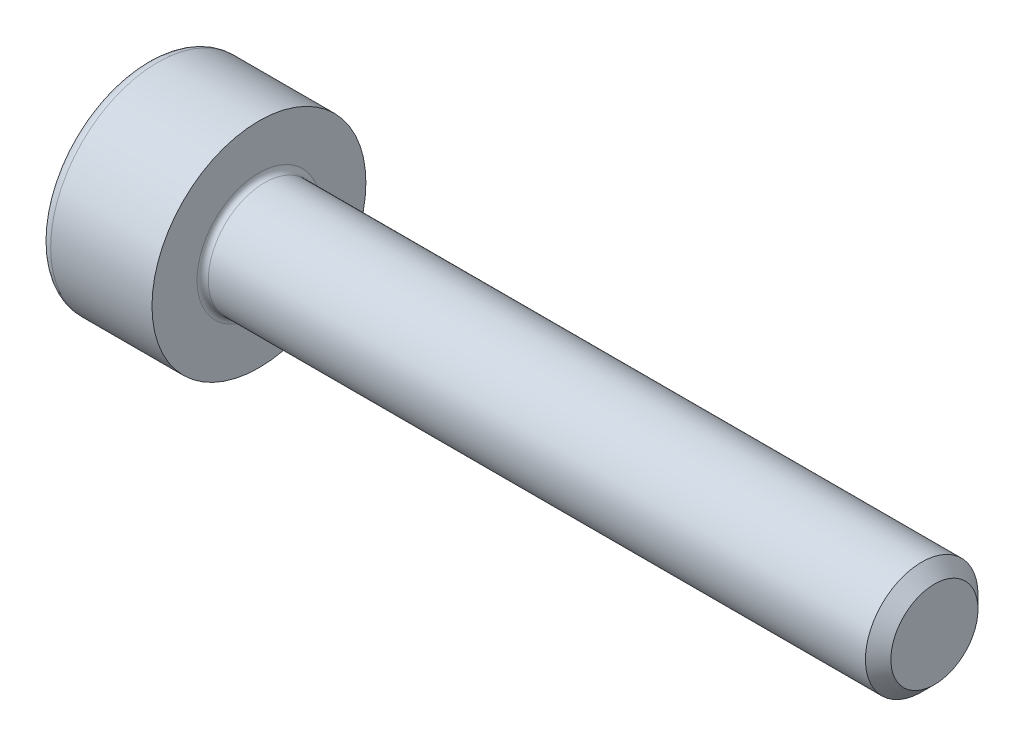
ISO-10303-21;
HEADER;
FILE_DESCRIPTION(('STEP AP214'),'2;1');
FILE_NAME('part.step','',(''),(''),'','','');
FILE_SCHEMA(('AUTOMOTIVE_DESIGN { 1 0 10303 214 1 1 1 1 }'));
ENDSEC;
DATA;
#1=APPLICATION_CONTEXT('core data for automotive mechanical design processes');
#2=APPLICATION_PROTOCOL_DEFINITION('international standard','automotive_design',2000,#1);
#3=PRODUCT_CONTEXT('',#1,'mechanical');
#4=PRODUCT('Part','Part','',(#3));
#5=PRODUCT_RELATED_PRODUCT_CATEGORY('part','',(#4));
#6=PRODUCT_DEFINITION_FORMATION('','',#4);
#7=PRODUCT_DEFINITION_CONTEXT('part definition',#1,'design');
#8=PRODUCT_DEFINITION('design','',#6,#7);
#9=PRODUCT_DEFINITION_SHAPE('','',#8);
#10=(LENGTH_UNIT() NAMED_UNIT(*) SI_UNIT(.MILLI.,.METRE.));
#11=(NAMED_UNIT(*) PLANE_ANGLE_UNIT() SI_UNIT($,.RADIAN.));
#12=(NAMED_UNIT(*) SI_UNIT($,.STERADIAN.) SOLID_ANGLE_UNIT());
#13=UNCERTAINTY_MEASURE_WITH_UNIT(LENGTH_MEASURE(1.E-05),#10,'distance_accuracy_value','');
#14=(GEOMETRIC_REPRESENTATION_CONTEXT(3) GLOBAL_UNCERTAINTY_ASSIGNED_CONTEXT((#13)) GLOBAL_UNIT_ASSIGNED_CONTEXT((#10,
#11,#12)) REPRESENTATION_CONTEXT('',''));
#15=CARTESIAN_POINT('',(0.,0.,0.));
#16=DIRECTION('',(0.,0.,1.));
#17=DIRECTION('',(1.,0.,0.));
#18=AXIS2_PLACEMENT_3D('',#15,#16,#17);
#19=CARTESIAN_POINT('',(1.,0.,0.));
#20=DIRECTION('',(-1.,0.,0.));
#21=DIRECTION('',(0.,0.,1.));
#22=AXIS2_PLACEMENT_3D('',#19,#20,#21);
#23=PLANE('',#22);
#24=DIRECTION('',(0.,-1.,0.));
#25=VECTOR('',#24,1.);
#26=CARTESIAN_POINT('',(1.,0.438786204584108,-0.760000000000004));
#27=LINE('',#26,#25);
#28=CARTESIAN_POINT('',(1.,0.438786204584108,-0.760000000000004));
#29=VERTEX_POINT('',#28);
#30=CARTESIAN_POINT('',(0.999999999980287,0.,-0.760000000000004));
#31=VERTEX_POINT('',#30);
#32=EDGE_CURVE('E249',#29,#31,#27,.T.);
#33=ORIENTED_EDGE('',*,*,#32,.T.);
#34=CARTESIAN_POINT('',(0.999999999980287,0.,0.));
#35=DIRECTION('',(1.,0.,0.));
#36=DIRECTION('',(0.,0.,-1.));
#37=AXIS2_PLACEMENT_3D('',#34,#35,#36);
#38=CIRCLE('',#37,0.760000000016132);
#39=CARTESIAN_POINT('',(0.999999999980287,0.658179306890144,-0.380000000008067));
#40=VERTEX_POINT('',#39);
#41=EDGE_CURVE('E49',#31,#40,#38,.T.);
#42=ORIENTED_EDGE('',*,*,#41,.T.);
#43=DIRECTION('',(0.,-0.500000000000001,-0.866025403784438));
#44=VECTOR('',#43,1.);
#45=CARTESIAN_POINT('',(1.,0.877572409168225,0.));
#46=LINE('',#45,#44);
#47=EDGE_CURVE('E265',#40,#29,#46,.T.);
#48=ORIENTED_EDGE('',*,*,#47,.T.);
#49=EDGE_LOOP('',(#33,#42,#48));
#50=FACE_BOUND('',#49,.T.);
#51=ADVANCED_FACE('F34',(#50),#23,.T.);
#52=CARTESIAN_POINT('',(1.,0.877572409168225,0.));
#53=VERTEX_POINT('',#52);
#54=EDGE_CURVE('E213',#53,#40,#46,.T.);
#55=ORIENTED_EDGE('',*,*,#54,.T.);
#56=CARTESIAN_POINT('',(0.999999999980287,0.658179306890145,0.380000000008064));
#57=VERTEX_POINT('',#56);
#58=EDGE_CURVE('E210',#40,#57,#38,.T.);
#59=ORIENTED_EDGE('',*,*,#58,.T.);
#60=DIRECTION('',(0.,0.499999999999998,-0.86602540378444));
#61=VECTOR('',#60,1.);
#62=CARTESIAN_POINT('',(1.,0.438786204584111,0.759999999999996));
#63=LINE('',#62,#61);
#64=EDGE_CURVE('E262',#57,#53,#63,.T.);
#65=ORIENTED_EDGE('',*,*,#64,.T.);
#66=EDGE_LOOP('',(#55,#59,#65));
#67=FACE_BOUND('',#66,.T.);
#68=ADVANCED_FACE('F124',(#67),#23,.T.);
#69=CARTESIAN_POINT('',(1.,0.438786204584111,0.759999999999996));
#70=VERTEX_POINT('',#69);
#71=EDGE_CURVE('E263',#70,#57,#63,.T.);
#72=ORIENTED_EDGE('',*,*,#71,.T.);
#73=CARTESIAN_POINT('',(0.999999999980287,0.,0.760000000016132));
#74=VERTEX_POINT('',#73);
#75=EDGE_CURVE('E243',#57,#74,#38,.T.);
#76=ORIENTED_EDGE('',*,*,#75,.T.);
#77=DIRECTION('',(0.,1.,0.));
#78=VECTOR('',#77,1.);
#79=CARTESIAN_POINT('',(1.,-0.43878620458412,0.759999999999997));
#80=LINE('',#79,#78);
#81=EDGE_CURVE('E259',#74,#70,#80,.T.);
#82=ORIENTED_EDGE('',*,*,#81,.T.);
#83=EDGE_LOOP('',(#72,#76,#82));
#84=FACE_BOUND('',#83,.T.);
#85=ADVANCED_FACE('F129',(#84),#23,.T.);
#86=CARTESIAN_POINT('',(1.,-0.43878620458412,0.759999999999997));
#87=VERTEX_POINT('',#86);
#88=EDGE_CURVE('E260',#87,#74,#80,.T.);
#89=ORIENTED_EDGE('',*,*,#88,.T.);
#90=CARTESIAN_POINT('',(0.999999999980287,-0.658179306890143,0.380000000008067));
#91=VERTEX_POINT('',#90);
#92=EDGE_CURVE('E247',#74,#91,#38,.T.);
#93=ORIENTED_EDGE('',*,*,#92,.T.);
#94=DIRECTION('',(0.,0.500000000000001,0.866025403784438));
#95=VECTOR('',#94,1.);
#96=CARTESIAN_POINT('',(1.,-0.877572409168236,0.));
#97=LINE('',#96,#95);
#98=EDGE_CURVE('E255',#91,#87,#97,.T.);
#99=ORIENTED_EDGE('',*,*,#98,.T.);
#100=EDGE_LOOP('',(#89,#93,#99));
#101=FACE_BOUND('',#100,.T.);
#102=ADVANCED_FACE('F282',(#101),#23,.T.);
#103=CARTESIAN_POINT('',(1.,-0.877572409168236,0.));
#104=VERTEX_POINT('',#103);
#105=EDGE_CURVE('E256',#104,#91,#97,.T.);
#106=ORIENTED_EDGE('',*,*,#105,.T.);
#107=CARTESIAN_POINT('',(0.999999999980287,-0.658179306890145,-0.380000000008064));
#108=VERTEX_POINT('',#107);
#109=EDGE_CURVE('E276',#91,#108,#38,.T.);
#110=ORIENTED_EDGE('',*,*,#109,.T.);
#111=DIRECTION('',(0.,-0.499999999999998,0.86602540378444));
#112=VECTOR('',#111,1.);
#113=CARTESIAN_POINT('',(1.,-0.438786204584123,-0.760000000000004));
#114=LINE('',#113,#112);
#115=EDGE_CURVE('E251',#108,#104,#114,.T.);
#116=ORIENTED_EDGE('',*,*,#115,.T.);
#117=EDGE_LOOP('',(#106,#110,#116));
#118=FACE_BOUND('',#117,.T.);
#119=ADVANCED_FACE('F122',(#118),#23,.T.);
#120=CARTESIAN_POINT('',(2.,0.,0.));
#121=DIRECTION('',(-1.,0.,0.));
#122=DIRECTION('',(0.,0.,1.));
#123=AXIS2_PLACEMENT_3D('',#120,#121,#122);
#124=CYLINDRICAL_SURFACE('',#123,1.9);
#125=CARTESIAN_POINT('',(0.2,0.,0.));
#126=DIRECTION('',(-1.,0.,0.));
#127=DIRECTION('',(0.,0.,1.));
#128=AXIS2_PLACEMENT_3D('',#125,#126,#127);
#129=CIRCLE('',#128,1.9);
#130=CARTESIAN_POINT('',(0.2,0.,1.9));
#131=VERTEX_POINT('',#130);
#132=EDGE_CURVE('E11',#131,#131,#129,.F.);
#133=ORIENTED_EDGE('',*,*,#132,.T.);
#134=EDGE_LOOP('',(#133));
#135=FACE_BOUND('',#134,.T.);
#136=CARTESIAN_POINT('',(2.,0.,0.));
#137=DIRECTION('',(-1.,0.,0.));
#138=DIRECTION('',(0.,0.,1.));
#139=AXIS2_PLACEMENT_3D('',#136,#137,#138);
#140=CIRCLE('',#139,1.9);
#141=CARTESIAN_POINT('',(2.,0.,1.9));
#142=VERTEX_POINT('',#141);
#143=EDGE_CURVE('E228',#142,#142,#140,.T.);
#144=ORIENTED_EDGE('',*,*,#143,.T.);
#145=EDGE_LOOP('',(#144));
#146=FACE_BOUND('',#145,.T.);
#147=ADVANCED_FACE('F170',(#135,#146),#124,.T.);
#148=CARTESIAN_POINT('',(2.,1.9,0.));
#149=DIRECTION('',(1.,0.,0.));
#150=DIRECTION('',(0.,0.,-1.));
#151=AXIS2_PLACEMENT_3D('',#148,#149,#150);
#152=PLANE('',#151);
#153=CARTESIAN_POINT('',(2.,0.,0.));
#154=DIRECTION('',(1.,0.,0.));
#155=DIRECTION('',(0.,0.,-1.));
#156=AXIS2_PLACEMENT_3D('',#153,#154,#155);
#157=CIRCLE('',#156,1.1);
#158=CARTESIAN_POINT('',(2.,0.,-1.1));
#159=VERTEX_POINT('',#158);
#160=EDGE_CURVE('E183',#159,#159,#157,.F.);
#161=ORIENTED_EDGE('',*,*,#160,.T.);
#162=EDGE_LOOP('',(#161));
#163=FACE_BOUND('',#162,.T.);
#164=ORIENTED_EDGE('',*,*,#143,.F.);
#165=EDGE_LOOP('',(#164));
#166=FACE_BOUND('',#165,.T.);
#167=ADVANCED_FACE('F166',(#163,#166),#152,.T.);
#168=CARTESIAN_POINT('',(0.,0.,0.));
#169=DIRECTION('',(-1.,0.,0.));
#170=DIRECTION('',(0.,0.,1.));
#171=AXIS2_PLACEMENT_3D('',#168,#169,#170);
#172=PLANE('',#171);
#173=CARTESIAN_POINT('',(0.,0.,0.));
#174=DIRECTION('',(-1.,0.,0.));
#175=DIRECTION('',(0.,0.,1.));
#176=AXIS2_PLACEMENT_3D('',#173,#174,#175);
#177=CIRCLE('',#176,1.7);
#178=CARTESIAN_POINT('',(0.,0.,1.7));
#179=VERTEX_POINT('',#178);
#180=EDGE_CURVE('E42',#179,#179,#177,.T.);
#181=ORIENTED_EDGE('',*,*,#180,.T.);
#182=EDGE_LOOP('',(#181));
#183=FACE_BOUND('',#182,.T.);
#184=DIRECTION('',(0.,-1.,0.));
#185=VECTOR('',#184,1.);
#186=CARTESIAN_POINT('',(0.,0.438786204584108,-0.760000000000004));
#187=LINE('',#186,#185);
#188=CARTESIAN_POINT('',(0.,0.438786204584108,-0.760000000000004));
#189=VERTEX_POINT('',#188);
#190=CARTESIAN_POINT('',(0.,-0.438786204584123,-0.760000000000004));
#191=VERTEX_POINT('',#190);
#192=EDGE_CURVE('E57',#189,#191,#187,.T.);
#193=ORIENTED_EDGE('',*,*,#192,.F.);
#194=DIRECTION('',(0.,-0.500000000000001,-0.866025403784438));
#195=VECTOR('',#194,1.);
#196=CARTESIAN_POINT('',(0.,0.877572409168225,0.));
#197=LINE('',#196,#195);
#198=CARTESIAN_POINT('',(0.,0.877572409168225,0.));
#199=VERTEX_POINT('',#198);
#200=EDGE_CURVE('E202',#199,#189,#197,.T.);
#201=ORIENTED_EDGE('',*,*,#200,.F.);
#202=DIRECTION('',(0.,0.499999999999998,-0.86602540378444));
#203=VECTOR('',#202,1.);
#204=CARTESIAN_POINT('',(0.,0.438786204584111,0.759999999999996));
#205=LINE('',#204,#203);
#206=CARTESIAN_POINT('',(0.,0.438786204584111,0.759999999999996));
#207=VERTEX_POINT('',#206);
#208=EDGE_CURVE('E221',#207,#199,#205,.T.);
#209=ORIENTED_EDGE('',*,*,#208,.F.);
#210=DIRECTION('',(0.,1.,0.));
#211=VECTOR('',#210,1.);
#212=CARTESIAN_POINT('',(0.,-0.43878620458412,0.759999999999997));
#213=LINE('',#212,#211);
#214=CARTESIAN_POINT('',(0.,-0.43878620458412,0.759999999999997));
#215=VERTEX_POINT('',#214);
#216=EDGE_CURVE('E218',#215,#207,#213,.T.);
#217=ORIENTED_EDGE('',*,*,#216,.F.);
#218=DIRECTION('',(0.,0.500000000000001,0.866025403784438));
#219=VECTOR('',#218,1.);
#220=CARTESIAN_POINT('',(0.,-0.877572409168236,0.));
#221=LINE('',#220,#219);
#222=CARTESIAN_POINT('',(0.,-0.877572409168236,0.));
#223=VERTEX_POINT('',#222);
#224=EDGE_CURVE('E207',#223,#215,#221,.T.);
#225=ORIENTED_EDGE('',*,*,#224,.F.);
#226=DIRECTION('',(0.,-0.499999999999998,0.86602540378444));
#227=VECTOR('',#226,1.);
#228=CARTESIAN_POINT('',(0.,-0.438786204584123,-0.760000000000004));
#229=LINE('',#228,#227);
#230=EDGE_CURVE('E205',#191,#223,#229,.T.);
#231=ORIENTED_EDGE('',*,*,#230,.F.);
#232=EDGE_LOOP('',(#193,#201,#209,#217,#225,#231));
#233=FACE_BOUND('',#232,.T.);
#234=ADVANCED_FACE('F162',(#183,#233),#172,.T.);
#235=CARTESIAN_POINT('',(14.,0.,0.));
#236=DIRECTION('',(-1.,0.,0.));
#237=DIRECTION('',(0.,0.,1.));
#238=AXIS2_PLACEMENT_3D('',#235,#236,#237);
#239=CYLINDRICAL_SURFACE('',#238,0.999999999999997);
#240=CARTESIAN_POINT('',(2.1,0.,0.));
#241=DIRECTION('',(1.,0.,0.));
#242=DIRECTION('',(0.,0.,-1.));
#243=AXIS2_PLACEMENT_3D('',#240,#241,#242);
#244=CIRCLE('',#243,0.999999999999997);
#245=CARTESIAN_POINT('',(2.1,0.,-0.999999999999997));
#246=VERTEX_POINT('',#245);
#247=EDGE_CURVE('E186',#246,#246,#244,.T.);
#248=ORIENTED_EDGE('',*,*,#247,.T.);
#249=EDGE_LOOP('',(#248));
#250=FACE_BOUND('',#249,.T.);
#251=CARTESIAN_POINT('',(13.7739999999843,0.,0.));
#252=DIRECTION('',(1.,0.,0.));
#253=DIRECTION('',(0.,0.,-1.));
#254=AXIS2_PLACEMENT_3D('',#251,#252,#253);
#255=CIRCLE('',#254,0.999999999999997);
#256=CARTESIAN_POINT('',(13.7739999999843,0.,-0.999999999999997));
#257=VERTEX_POINT('',#256);
#258=EDGE_CURVE('E187',#257,#257,#255,.F.);
#259=ORIENTED_EDGE('',*,*,#258,.T.);
#260=EDGE_LOOP('',(#259));
#261=FACE_BOUND('',#260,.T.);
#262=ADVANCED_FACE('F158',(#250,#261),#239,.T.);
#263=CARTESIAN_POINT('',(14.,0.,0.));
#264=DIRECTION('',(1.,0.,0.));
#265=DIRECTION('',(0.,0.,-1.));
#266=AXIS2_PLACEMENT_3D('',#263,#264,#265);
#267=PLANE('',#266);
#268=CARTESIAN_POINT('',(14.,0.,0.));
#269=DIRECTION('',(1.,0.,0.));
#270=DIRECTION('',(0.,0.,-1.));
#271=AXIS2_PLACEMENT_3D('',#268,#269,#270);
#272=CIRCLE('',#271,0.773999999927407);
#273=CARTESIAN_POINT('',(14.,0.,-0.773999999927407));
#274=VERTEX_POINT('',#273);
#275=EDGE_CURVE('E191',#274,#274,#272,.T.);
#276=ORIENTED_EDGE('',*,*,#275,.T.);
#277=EDGE_LOOP('',(#276));
#278=FACE_BOUND('',#277,.T.);
#279=ADVANCED_FACE('F155',(#278),#267,.T.);
#280=CARTESIAN_POINT('',(1.,0.438786204584108,-0.760000000000004));
#281=DIRECTION('',(0.,0.,-1.));
#282=DIRECTION('',(0.,1.,0.));
#283=AXIS2_PLACEMENT_3D('',#280,#281,#282);
#284=PLANE('',#283);
#285=ORIENTED_EDGE('',*,*,#192,.T.);
#286=DIRECTION('',(-1.,0.,0.));
#287=VECTOR('',#286,1.);
#288=CARTESIAN_POINT('',(1.,-0.438786204584123,-0.760000000000004));
#289=LINE('',#288,#287);
#290=CARTESIAN_POINT('',(1.,-0.438786204584123,-0.760000000000004));
#291=VERTEX_POINT('',#290);
#292=EDGE_CURVE('E237',#291,#191,#289,.T.);
#293=ORIENTED_EDGE('',*,*,#292,.F.);
#294=EDGE_CURVE('E225',#31,#291,#27,.T.);
#295=ORIENTED_EDGE('',*,*,#294,.F.);
#296=ORIENTED_EDGE('',*,*,#32,.F.);
#297=DIRECTION('',(-1.,0.,0.));
#298=VECTOR('',#297,1.);
#299=CARTESIAN_POINT('',(1.,0.438786204584108,-0.760000000000004));
#300=LINE('',#299,#298);
#301=EDGE_CURVE('E226',#29,#189,#300,.T.);
#302=ORIENTED_EDGE('',*,*,#301,.T.);
#303=EDGE_LOOP('',(#285,#293,#295,#296,#302));
#304=FACE_BOUND('',#303,.T.);
#305=ADVANCED_FACE('F137',(#304),#284,.F.);
#306=CARTESIAN_POINT('',(1.,0.877572409168225,0.));
#307=DIRECTION('',(0.,0.866025403784438,-0.500000000000001));
#308=DIRECTION('',(0.,0.500000000000001,0.866025403784438));
#309=AXIS2_PLACEMENT_3D('',#306,#307,#308);
#310=PLANE('',#309);
#311=ORIENTED_EDGE('',*,*,#200,.T.);
#312=ORIENTED_EDGE('',*,*,#301,.F.);
#313=ORIENTED_EDGE('',*,*,#47,.F.);
#314=ORIENTED_EDGE('',*,*,#54,.F.);
#315=DIRECTION('',(-1.,0.,0.));
#316=VECTOR('',#315,1.);
#317=CARTESIAN_POINT('',(1.,0.877572409168225,0.));
#318=LINE('',#317,#316);
#319=EDGE_CURVE('E229',#53,#199,#318,.T.);
#320=ORIENTED_EDGE('',*,*,#319,.T.);
#321=EDGE_LOOP('',(#311,#312,#313,#314,#320));
#322=FACE_BOUND('',#321,.T.);
#323=ADVANCED_FACE('F133',(#322),#310,.F.);
#324=CARTESIAN_POINT('',(1.,0.438786204584111,0.759999999999996));
#325=DIRECTION('',(0.,0.86602540378444,0.499999999999998));
#326=DIRECTION('',(0.,-0.499999999999998,0.86602540378444));
#327=AXIS2_PLACEMENT_3D('',#324,#325,#326);
#328=PLANE('',#327);
#329=ORIENTED_EDGE('',*,*,#208,.T.);
#330=ORIENTED_EDGE('',*,*,#319,.F.);
#331=ORIENTED_EDGE('',*,*,#64,.F.);
#332=ORIENTED_EDGE('',*,*,#71,.F.);
#333=DIRECTION('',(-1.,0.,0.));
#334=VECTOR('',#333,1.);
#335=CARTESIAN_POINT('',(1.,0.438786204584111,0.759999999999996));
#336=LINE('',#335,#334);
#337=EDGE_CURVE('E231',#70,#207,#336,.T.);
#338=ORIENTED_EDGE('',*,*,#337,.T.);
#339=EDGE_LOOP('',(#329,#330,#331,#332,#338));
#340=FACE_BOUND('',#339,.T.);
#341=ADVANCED_FACE('F136',(#340),#328,.F.);
#342=CARTESIAN_POINT('',(1.,-0.43878620458412,0.759999999999997));
#343=DIRECTION('',(0.,0.,1.));
#344=DIRECTION('',(0.,-1.,0.));
#345=AXIS2_PLACEMENT_3D('',#342,#343,#344);
#346=PLANE('',#345);
#347=ORIENTED_EDGE('',*,*,#216,.T.);
#348=ORIENTED_EDGE('',*,*,#337,.F.);
#349=ORIENTED_EDGE('',*,*,#81,.F.);
#350=ORIENTED_EDGE('',*,*,#88,.F.);
#351=DIRECTION('',(-1.,0.,0.));
#352=VECTOR('',#351,1.);
#353=CARTESIAN_POINT('',(1.,-0.43878620458412,0.759999999999997));
#354=LINE('',#353,#352);
#355=EDGE_CURVE('E233',#87,#215,#354,.T.);
#356=ORIENTED_EDGE('',*,*,#355,.T.);
#357=EDGE_LOOP('',(#347,#348,#349,#350,#356));
#358=FACE_BOUND('',#357,.T.);
#359=ADVANCED_FACE('F141',(#358),#346,.F.);
#360=CARTESIAN_POINT('',(1.,-0.877572409168236,0.));
#361=DIRECTION('',(0.,-0.866025403784438,0.500000000000001));
#362=DIRECTION('',(0.,-0.500000000000001,-0.866025403784438));
#363=AXIS2_PLACEMENT_3D('',#360,#361,#362);
#364=PLANE('',#363);
#365=ORIENTED_EDGE('',*,*,#224,.T.);
#366=ORIENTED_EDGE('',*,*,#355,.F.);
#367=ORIENTED_EDGE('',*,*,#98,.F.);
#368=ORIENTED_EDGE('',*,*,#105,.F.);
#369=DIRECTION('',(-1.,0.,0.));
#370=VECTOR('',#369,1.);
#371=CARTESIAN_POINT('',(1.,-0.877572409168236,0.));
#372=LINE('',#371,#370);
#373=EDGE_CURVE('E235',#104,#223,#372,.T.);
#374=ORIENTED_EDGE('',*,*,#373,.T.);
#375=EDGE_LOOP('',(#365,#366,#367,#368,#374));
#376=FACE_BOUND('',#375,.T.);
#377=ADVANCED_FACE('F145',(#376),#364,.F.);
#378=CARTESIAN_POINT('',(1.,-0.438786204584123,-0.760000000000004));
#379=DIRECTION('',(0.,-0.86602540378444,-0.499999999999998));
#380=DIRECTION('',(0.,0.499999999999998,-0.86602540378444));
#381=AXIS2_PLACEMENT_3D('',#378,#379,#380);
#382=PLANE('',#381);
#383=ORIENTED_EDGE('',*,*,#230,.T.);
#384=ORIENTED_EDGE('',*,*,#373,.F.);
#385=ORIENTED_EDGE('',*,*,#115,.F.);
#386=EDGE_CURVE('E252',#291,#108,#114,.T.);
#387=ORIENTED_EDGE('',*,*,#386,.F.);
#388=ORIENTED_EDGE('',*,*,#292,.T.);
#389=EDGE_LOOP('',(#383,#384,#385,#387,#388));
#390=FACE_BOUND('',#389,.T.);
#391=ADVANCED_FACE('F119',(#390),#382,.F.);
#392=ORIENTED_EDGE('',*,*,#386,.T.);
#393=EDGE_CURVE('E211',#108,#31,#38,.T.);
#394=ORIENTED_EDGE('',*,*,#393,.T.);
#395=ORIENTED_EDGE('',*,*,#294,.T.);
#396=EDGE_LOOP('',(#392,#394,#395));
#397=FACE_BOUND('',#396,.T.);
#398=ADVANCED_FACE('F110',(#397),#23,.T.);
#399=CARTESIAN_POINT('',(1.43878620457372,0.,0.));
#400=DIRECTION('',(-1.,0.,0.));
#401=DIRECTION('',(0.,0.,1.));
#402=AXIS2_PLACEMENT_3D('',#399,#400,#401);
#403=CONICAL_SURFACE('',#402,0.,1.0471975511966);
#404=ORIENTED_EDGE('',*,*,#41,.F.);
#405=ORIENTED_EDGE('',*,*,#393,.F.);
#406=ORIENTED_EDGE('',*,*,#109,.F.);
#407=ORIENTED_EDGE('',*,*,#92,.F.);
#408=ORIENTED_EDGE('',*,*,#75,.F.);
#409=ORIENTED_EDGE('',*,*,#58,.F.);
#410=EDGE_LOOP('',(#404,#405,#406,#407,#408,#409));
#411=FACE_BOUND('',#410,.T.);
#412=CARTESIAN_POINT('',(1.43878620457372,0.,0.));
#413=VERTEX_POINT('',#412);
#414=VERTEX_LOOP('',#413);
#415=FACE_BOUND('',#414,.T.);
#416=ADVANCED_FACE('F107',(#411,#415),#403,.F.);
#417=CARTESIAN_POINT('',(14.,0.,0.));
#418=DIRECTION('',(-1.,0.,0.));
#419=DIRECTION('',(0.,0.,1.));
#420=AXIS2_PLACEMENT_3D('',#417,#418,#419);
#421=CONICAL_SURFACE('',#420,0.773999999927407,0.785398163523202);
#422=ORIENTED_EDGE('',*,*,#258,.F.);
#423=EDGE_LOOP('',(#422));
#424=FACE_BOUND('',#423,.T.);
#425=ORIENTED_EDGE('',*,*,#275,.F.);
#426=EDGE_LOOP('',(#425));
#427=FACE_BOUND('',#426,.T.);
#428=ADVANCED_FACE('F109',(#424,#427),#421,.T.);
#429=CARTESIAN_POINT('',(2.1,0.,0.));
#430=DIRECTION('',(1.,0.,0.));
#431=DIRECTION('',(0.,0.,-1.));
#432=AXIS2_PLACEMENT_3D('',#429,#430,#431);
#433=TOROIDAL_SURFACE('',#432,1.1,0.1);
#434=ORIENTED_EDGE('',*,*,#160,.F.);
#435=EDGE_LOOP('',(#434));
#436=FACE_BOUND('',#435,.T.);
#437=ORIENTED_EDGE('',*,*,#247,.F.);
#438=EDGE_LOOP('',(#437));
#439=FACE_BOUND('',#438,.T.);
#440=ADVANCED_FACE('F116',(#436,#439),#433,.F.);
#441=CARTESIAN_POINT('',(0.2,0.,0.));
#442=DIRECTION('',(-1.,0.,0.));
#443=DIRECTION('',(0.,0.,1.));
#444=AXIS2_PLACEMENT_3D('',#441,#442,#443);
#445=TOROIDAL_SURFACE('',#444,1.7,0.2);
#446=ORIENTED_EDGE('',*,*,#132,.F.);
#447=EDGE_LOOP('',(#446));
#448=FACE_BOUND('',#447,.T.);
#449=ORIENTED_EDGE('',*,*,#180,.F.);
#450=EDGE_LOOP('',(#449));
#451=FACE_BOUND('',#450,.T.);
#452=ADVANCED_FACE('F36',(#448,#451),#445,.T.);
#453=CLOSED_SHELL('',(#51,#68,#85,#102,#119,#147,#167,#234,#262,#279,#305,#323,#341,#359,#377,
#391,#398,#416,#428,#440,#452));
#454=MANIFOLD_SOLID_BREP('B2',#453);
#455=ADVANCED_BREP_SHAPE_REPRESENTATION('',(#18,#454),#14);
#456=SHAPE_DEFINITION_REPRESENTATION(#9,#455);
ENDSEC;
END-ISO-10303-21;
